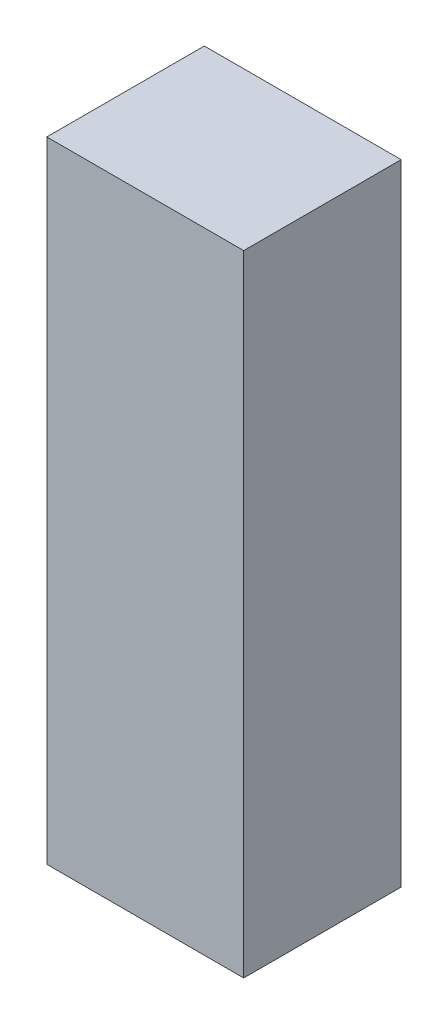
ISO-10303-21;
HEADER;
FILE_DESCRIPTION(('STEP AP214'),'2;1');
FILE_NAME('part.step','',(''),(''),'','','');
FILE_SCHEMA(('AUTOMOTIVE_DESIGN { 1 0 10303 214 1 1 1 1 }'));
ENDSEC;
DATA;
#1=APPLICATION_CONTEXT('core data for automotive mechanical design processes');
#2=APPLICATION_PROTOCOL_DEFINITION('international standard','automotive_design',2000,#1);
#3=PRODUCT_CONTEXT('',#1,'mechanical');
#4=PRODUCT('Part','Part','',(#3));
#5=PRODUCT_RELATED_PRODUCT_CATEGORY('part','',(#4));
#6=PRODUCT_DEFINITION_FORMATION('','',#4);
#7=PRODUCT_DEFINITION_CONTEXT('part definition',#1,'design');
#8=PRODUCT_DEFINITION('design','',#6,#7);
#9=PRODUCT_DEFINITION_SHAPE('','',#8);
#10=(LENGTH_UNIT() NAMED_UNIT(*) SI_UNIT(.MILLI.,.METRE.));
#11=(NAMED_UNIT(*) PLANE_ANGLE_UNIT() SI_UNIT($,.RADIAN.));
#12=(NAMED_UNIT(*) SI_UNIT($,.STERADIAN.) SOLID_ANGLE_UNIT());
#13=UNCERTAINTY_MEASURE_WITH_UNIT(LENGTH_MEASURE(1.E-05),#10,'distance_accuracy_value','');
#14=(GEOMETRIC_REPRESENTATION_CONTEXT(3) GLOBAL_UNCERTAINTY_ASSIGNED_CONTEXT((#13)) GLOBAL_UNIT_ASSIGNED_CONTEXT((#10,
#11,#12)) REPRESENTATION_CONTEXT('',''));
#15=CARTESIAN_POINT('',(0.,0.,0.));
#16=DIRECTION('',(0.,0.,1.));
#17=DIRECTION('',(1.,0.,0.));
#18=AXIS2_PLACEMENT_3D('',#15,#16,#17);
#19=CARTESIAN_POINT('',(0.,0.,0.2));
#20=DIRECTION('',(0.,1.,0.));
#21=DIRECTION('',(0.,0.,1.));
#22=AXIS2_PLACEMENT_3D('',#19,#20,#21);
#23=PLANE('',#22);
#24=DIRECTION('',(1.,0.,0.));
#25=VECTOR('',#24,1.);
#26=CARTESIAN_POINT('',(0.,0.,0.));
#27=LINE('',#26,#25);
#28=CARTESIAN_POINT('',(0.,0.,0.));
#29=VERTEX_POINT('',#28);
#30=CARTESIAN_POINT('',(0.25,0.,0.));
#31=VERTEX_POINT('',#30);
#32=EDGE_CURVE('E98',#29,#31,#27,.T.);
#33=ORIENTED_EDGE('',*,*,#32,.T.);
#34=DIRECTION('',(0.,0.,-1.));
#35=VECTOR('',#34,1.);
#36=CARTESIAN_POINT('',(0.25,0.,0.2));
#37=LINE('',#36,#35);
#38=CARTESIAN_POINT('',(0.25,0.,0.2));
#39=VERTEX_POINT('',#38);
#40=EDGE_CURVE('E11',#39,#31,#37,.T.);
#41=ORIENTED_EDGE('',*,*,#40,.F.);
#42=DIRECTION('',(1.,0.,0.));
#43=VECTOR('',#42,1.);
#44=CARTESIAN_POINT('',(0.,0.,0.2));
#45=LINE('',#44,#43);
#46=CARTESIAN_POINT('',(0.,0.,0.2));
#47=VERTEX_POINT('',#46);
#48=EDGE_CURVE('E84',#47,#39,#45,.T.);
#49=ORIENTED_EDGE('',*,*,#48,.F.);
#50=DIRECTION('',(0.,0.,-1.));
#51=VECTOR('',#50,1.);
#52=CARTESIAN_POINT('',(0.,0.,0.2));
#53=LINE('',#52,#51);
#54=EDGE_CURVE('E51',#47,#29,#53,.T.);
#55=ORIENTED_EDGE('',*,*,#54,.T.);
#56=EDGE_LOOP('',(#33,#41,#49,#55));
#57=FACE_BOUND('',#56,.T.);
#58=ADVANCED_FACE('F35',(#57),#23,.F.);
#59=CARTESIAN_POINT('',(0.25,0.,0.2));
#60=DIRECTION('',(-1.,0.,0.));
#61=DIRECTION('',(0.,0.,1.));
#62=AXIS2_PLACEMENT_3D('',#59,#60,#61);
#63=PLANE('',#62);
#64=DIRECTION('',(0.,1.,0.));
#65=VECTOR('',#64,1.);
#66=CARTESIAN_POINT('',(0.25,0.,0.));
#67=LINE('',#66,#65);
#68=CARTESIAN_POINT('',(0.25,0.8,0.));
#69=VERTEX_POINT('',#68);
#70=EDGE_CURVE('E89',#31,#69,#67,.T.);
#71=ORIENTED_EDGE('',*,*,#70,.T.);
#72=DIRECTION('',(0.,0.,-1.));
#73=VECTOR('',#72,1.);
#74=CARTESIAN_POINT('',(0.25,0.8,0.2));
#75=LINE('',#74,#73);
#76=CARTESIAN_POINT('',(0.25,0.8,0.2));
#77=VERTEX_POINT('',#76);
#78=EDGE_CURVE('E43',#77,#69,#75,.T.);
#79=ORIENTED_EDGE('',*,*,#78,.F.);
#80=DIRECTION('',(0.,1.,0.));
#81=VECTOR('',#80,1.);
#82=CARTESIAN_POINT('',(0.25,0.,0.2));
#83=LINE('',#82,#81);
#84=EDGE_CURVE('E76',#39,#77,#83,.T.);
#85=ORIENTED_EDGE('',*,*,#84,.F.);
#86=ORIENTED_EDGE('',*,*,#40,.T.);
#87=EDGE_LOOP('',(#71,#79,#85,#86));
#88=FACE_BOUND('',#87,.T.);
#89=ADVANCED_FACE('F88',(#88),#63,.F.);
#90=CARTESIAN_POINT('',(0.,0.8,0.2));
#91=DIRECTION('',(0.,1.,0.));
#92=DIRECTION('',(0.,0.,1.));
#93=AXIS2_PLACEMENT_3D('',#90,#91,#92);
#94=PLANE('',#93);
#95=DIRECTION('',(1.,0.,0.));
#96=VECTOR('',#95,1.);
#97=CARTESIAN_POINT('',(0.,0.8,0.));
#98=LINE('',#97,#96);
#99=CARTESIAN_POINT('',(0.,0.8,0.));
#100=VERTEX_POINT('',#99);
#101=EDGE_CURVE('E101',#100,#69,#98,.T.);
#102=ORIENTED_EDGE('',*,*,#101,.F.);
#103=DIRECTION('',(0.,0.,-1.));
#104=VECTOR('',#103,1.);
#105=CARTESIAN_POINT('',(0.,0.8,0.2));
#106=LINE('',#105,#104);
#107=CARTESIAN_POINT('',(0.,0.8,0.2));
#108=VERTEX_POINT('',#107);
#109=EDGE_CURVE('E65',#108,#100,#106,.T.);
#110=ORIENTED_EDGE('',*,*,#109,.F.);
#111=DIRECTION('',(1.,0.,0.));
#112=VECTOR('',#111,1.);
#113=CARTESIAN_POINT('',(0.,0.8,0.2));
#114=LINE('',#113,#112);
#115=EDGE_CURVE('E83',#108,#77,#114,.T.);
#116=ORIENTED_EDGE('',*,*,#115,.T.);
#117=ORIENTED_EDGE('',*,*,#78,.T.);
#118=EDGE_LOOP('',(#102,#110,#116,#117));
#119=FACE_BOUND('',#118,.T.);
#120=ADVANCED_FACE('F92',(#119),#94,.T.);
#121=CARTESIAN_POINT('',(0.,0.,0.2));
#122=DIRECTION('',(-1.,0.,0.));
#123=DIRECTION('',(0.,0.,1.));
#124=AXIS2_PLACEMENT_3D('',#121,#122,#123);
#125=PLANE('',#124);
#126=DIRECTION('',(0.,1.,0.));
#127=VECTOR('',#126,1.);
#128=CARTESIAN_POINT('',(0.,0.,0.));
#129=LINE('',#128,#127);
#130=EDGE_CURVE('E103',#29,#100,#129,.T.);
#131=ORIENTED_EDGE('',*,*,#130,.F.);
#132=ORIENTED_EDGE('',*,*,#54,.F.);
#133=DIRECTION('',(0.,1.,0.));
#134=VECTOR('',#133,1.);
#135=CARTESIAN_POINT('',(0.,0.,0.2));
#136=LINE('',#135,#134);
#137=EDGE_CURVE('E93',#47,#108,#136,.T.);
#138=ORIENTED_EDGE('',*,*,#137,.T.);
#139=ORIENTED_EDGE('',*,*,#109,.T.);
#140=EDGE_LOOP('',(#131,#132,#138,#139));
#141=FACE_BOUND('',#140,.T.);
#142=ADVANCED_FACE('F109',(#141),#125,.T.);
#143=CARTESIAN_POINT('',(0.,0.,0.2));
#144=DIRECTION('',(0.,0.,1.));
#145=DIRECTION('',(1.,0.,0.));
#146=AXIS2_PLACEMENT_3D('',#143,#144,#145);
#147=PLANE('',#146);
#148=ORIENTED_EDGE('',*,*,#48,.T.);
#149=ORIENTED_EDGE('',*,*,#84,.T.);
#150=ORIENTED_EDGE('',*,*,#115,.F.);
#151=ORIENTED_EDGE('',*,*,#137,.F.);
#152=EDGE_LOOP('',(#148,#149,#150,#151));
#153=FACE_BOUND('',#152,.T.);
#154=ADVANCED_FACE('F80',(#153),#147,.T.);
#155=CARTESIAN_POINT('',(0.,0.,0.));
#156=DIRECTION('',(0.,0.,1.));
#157=DIRECTION('',(1.,0.,0.));
#158=AXIS2_PLACEMENT_3D('',#155,#156,#157);
#159=PLANE('',#158);
#160=ORIENTED_EDGE('',*,*,#32,.F.);
#161=ORIENTED_EDGE('',*,*,#130,.T.);
#162=ORIENTED_EDGE('',*,*,#101,.T.);
#163=ORIENTED_EDGE('',*,*,#70,.F.);
#164=EDGE_LOOP('',(#160,#161,#162,#163));
#165=FACE_BOUND('',#164,.T.);
#166=ADVANCED_FACE('F108',(#165),#159,.F.);
#167=CLOSED_SHELL('',(#58,#89,#120,#142,#154,#166));
#168=MANIFOLD_SOLID_BREP('B2',#167);
#169=ADVANCED_BREP_SHAPE_REPRESENTATION('',(#18,#168),#14);
#170=SHAPE_DEFINITION_REPRESENTATION(#9,#169);
ENDSEC;
END-ISO-10303-21;
